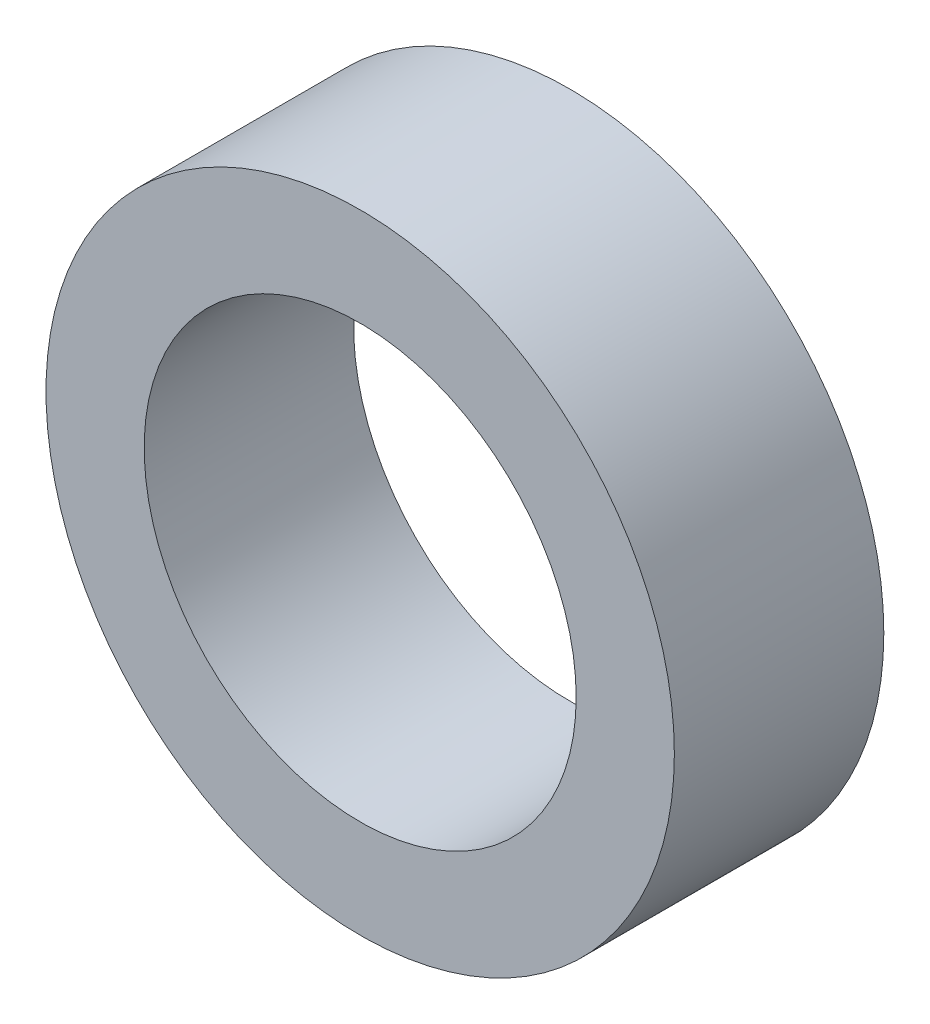
ISO-10303-21;
HEADER;
FILE_DESCRIPTION(('STEP AP214'),'2;1');
FILE_NAME('part.step','',(''),(''),'','','');
FILE_SCHEMA(('AUTOMOTIVE_DESIGN { 1 0 10303 214 1 1 1 1 }'));
ENDSEC;
DATA;
#1=APPLICATION_CONTEXT('core data for automotive mechanical design processes');
#2=APPLICATION_PROTOCOL_DEFINITION('international standard','automotive_design',2000,#1);
#3=PRODUCT_CONTEXT('',#1,'mechanical');
#4=PRODUCT('Part','Part','',(#3));
#5=PRODUCT_RELATED_PRODUCT_CATEGORY('part','',(#4));
#6=PRODUCT_DEFINITION_FORMATION('','',#4);
#7=PRODUCT_DEFINITION_CONTEXT('part definition',#1,'design');
#8=PRODUCT_DEFINITION('design','',#6,#7);
#9=PRODUCT_DEFINITION_SHAPE('','',#8);
#10=(LENGTH_UNIT() NAMED_UNIT(*) SI_UNIT(.MILLI.,.METRE.));
#11=(NAMED_UNIT(*) PLANE_ANGLE_UNIT() SI_UNIT($,.RADIAN.));
#12=(NAMED_UNIT(*) SI_UNIT($,.STERADIAN.) SOLID_ANGLE_UNIT());
#13=UNCERTAINTY_MEASURE_WITH_UNIT(LENGTH_MEASURE(1.E-05),#10,'distance_accuracy_value','');
#14=(GEOMETRIC_REPRESENTATION_CONTEXT(3) GLOBAL_UNCERTAINTY_ASSIGNED_CONTEXT((#13)) GLOBAL_UNIT_ASSIGNED_CONTEXT((#10,
#11,#12)) REPRESENTATION_CONTEXT('',''));
#15=CARTESIAN_POINT('',(0.,0.,0.));
#16=DIRECTION('',(0.,0.,1.));
#17=DIRECTION('',(1.,0.,0.));
#18=AXIS2_PLACEMENT_3D('',#15,#16,#17);
#19=CARTESIAN_POINT('',(-32.1585212117209,7.92928056359185,4.));
#20=DIRECTION('',(0.,0.,1.));
#21=DIRECTION('',(1.,0.,0.));
#22=AXIS2_PLACEMENT_3D('',#19,#20,#21);
#23=PLANE('',#22);
#24=CARTESIAN_POINT('',(-32.1585212117209,7.92928056359185,4.));
#25=DIRECTION('',(0.,0.,1.));
#26=DIRECTION('',(1.,0.,0.));
#27=AXIS2_PLACEMENT_3D('',#24,#25,#26);
#28=CIRCLE('',#27,6.);
#29=CARTESIAN_POINT('',(-26.1585212117209,7.92928056359185,4.));
#30=VERTEX_POINT('',#29);
#31=EDGE_CURVE('E10',#30,#30,#28,.T.);
#32=ORIENTED_EDGE('',*,*,#31,.T.);
#33=EDGE_LOOP('',(#32));
#34=FACE_BOUND('',#33,.T.);
#35=CARTESIAN_POINT('',(-32.1585212117209,7.92928056359185,4.));
#36=DIRECTION('',(0.,0.,1.));
#37=DIRECTION('',(1.,0.,0.));
#38=AXIS2_PLACEMENT_3D('',#35,#36,#37);
#39=CIRCLE('',#38,4.125);
#40=CARTESIAN_POINT('',(-28.0335212117209,7.92928056359185,4.));
#41=VERTEX_POINT('',#40);
#42=EDGE_CURVE('E53',#41,#41,#39,.T.);
#43=ORIENTED_EDGE('',*,*,#42,.F.);
#44=EDGE_LOOP('',(#43));
#45=FACE_BOUND('',#44,.T.);
#46=ADVANCED_FACE('F39',(#34,#45),#23,.T.);
#47=CARTESIAN_POINT('',(-32.1585212117209,7.92928056359185,0.));
#48=DIRECTION('',(0.,0.,1.));
#49=DIRECTION('',(1.,0.,0.));
#50=AXIS2_PLACEMENT_3D('',#47,#48,#49);
#51=PLANE('',#50);
#52=CARTESIAN_POINT('',(-32.1585212117209,7.92928056359185,0.));
#53=DIRECTION('',(0.,0.,1.));
#54=DIRECTION('',(1.,0.,0.));
#55=AXIS2_PLACEMENT_3D('',#52,#53,#54);
#56=CIRCLE('',#55,6.);
#57=CARTESIAN_POINT('',(-26.1585212117209,7.92928056359185,0.));
#58=VERTEX_POINT('',#57);
#59=EDGE_CURVE('E43',#58,#58,#56,.T.);
#60=ORIENTED_EDGE('',*,*,#59,.F.);
#61=EDGE_LOOP('',(#60));
#62=FACE_BOUND('',#61,.T.);
#63=CARTESIAN_POINT('',(-32.1585212117209,7.92928056359185,0.));
#64=DIRECTION('',(0.,0.,1.));
#65=DIRECTION('',(1.,0.,0.));
#66=AXIS2_PLACEMENT_3D('',#63,#64,#65);
#67=CIRCLE('',#66,4.125);
#68=CARTESIAN_POINT('',(-28.0335212117209,7.92928056359185,0.));
#69=VERTEX_POINT('',#68);
#70=EDGE_CURVE('E55',#69,#69,#67,.T.);
#71=ORIENTED_EDGE('',*,*,#70,.T.);
#72=EDGE_LOOP('',(#71));
#73=FACE_BOUND('',#72,.T.);
#74=ADVANCED_FACE('F66',(#62,#73),#51,.F.);
#75=CARTESIAN_POINT('',(-32.1585212117209,7.92928056359185,4.));
#76=DIRECTION('',(0.,0.,-1.));
#77=DIRECTION('',(-1.,0.,0.));
#78=AXIS2_PLACEMENT_3D('',#75,#76,#77);
#79=CYLINDRICAL_SURFACE('',#78,6.);
#80=ORIENTED_EDGE('',*,*,#31,.F.);
#81=EDGE_LOOP('',(#80));
#82=FACE_BOUND('',#81,.T.);
#83=ORIENTED_EDGE('',*,*,#59,.T.);
#84=EDGE_LOOP('',(#83));
#85=FACE_BOUND('',#84,.T.);
#86=ADVANCED_FACE('F41',(#82,#85),#79,.T.);
#87=CARTESIAN_POINT('',(-32.1585212117209,7.92928056359185,4.));
#88=DIRECTION('',(0.,0.,-1.));
#89=DIRECTION('',(-1.,0.,0.));
#90=AXIS2_PLACEMENT_3D('',#87,#88,#89);
#91=CYLINDRICAL_SURFACE('',#90,4.125);
#92=ORIENTED_EDGE('',*,*,#42,.T.);
#93=EDGE_LOOP('',(#92));
#94=FACE_BOUND('',#93,.T.);
#95=ORIENTED_EDGE('',*,*,#70,.F.);
#96=EDGE_LOOP('',(#95));
#97=FACE_BOUND('',#96,.T.);
#98=ADVANCED_FACE('F62',(#94,#97),#91,.F.);
#99=CLOSED_SHELL('',(#46,#74,#86,#98));
#100=MANIFOLD_SOLID_BREP('B2',#99);
#101=ADVANCED_BREP_SHAPE_REPRESENTATION('',(#18,#100),#14);
#102=SHAPE_DEFINITION_REPRESENTATION(#9,#101);
ENDSEC;
END-ISO-10303-21;
